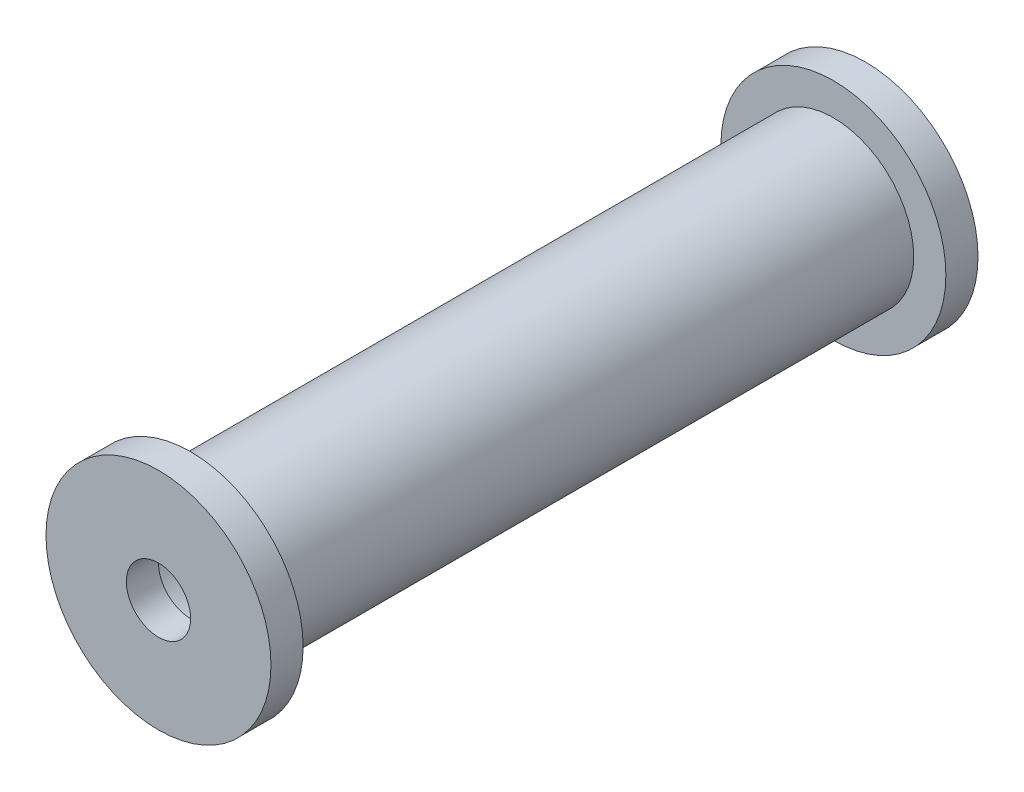
ISO-10303-21;
HEADER;
FILE_DESCRIPTION(('STEP AP214'),'2;1');
FILE_NAME('part.step','',(''),(''),'','','');
FILE_SCHEMA(('AUTOMOTIVE_DESIGN { 1 0 10303 214 1 1 1 1 }'));
ENDSEC;
DATA;
#1=APPLICATION_CONTEXT('core data for automotive mechanical design processes');
#2=APPLICATION_PROTOCOL_DEFINITION('international standard','automotive_design',2000,#1);
#3=PRODUCT_CONTEXT('',#1,'mechanical');
#4=PRODUCT('Part','Part','',(#3));
#5=PRODUCT_RELATED_PRODUCT_CATEGORY('part','',(#4));
#6=PRODUCT_DEFINITION_FORMATION('','',#4);
#7=PRODUCT_DEFINITION_CONTEXT('part definition',#1,'design');
#8=PRODUCT_DEFINITION('design','',#6,#7);
#9=PRODUCT_DEFINITION_SHAPE('','',#8);
#10=(LENGTH_UNIT() NAMED_UNIT(*) SI_UNIT(.MILLI.,.METRE.));
#11=(NAMED_UNIT(*) PLANE_ANGLE_UNIT() SI_UNIT($,.RADIAN.));
#12=(NAMED_UNIT(*) SI_UNIT($,.STERADIAN.) SOLID_ANGLE_UNIT());
#13=UNCERTAINTY_MEASURE_WITH_UNIT(LENGTH_MEASURE(1.E-05),#10,'distance_accuracy_value','');
#14=(GEOMETRIC_REPRESENTATION_CONTEXT(3) GLOBAL_UNCERTAINTY_ASSIGNED_CONTEXT((#13)) GLOBAL_UNIT_ASSIGNED_CONTEXT((#10,
#11,#12)) REPRESENTATION_CONTEXT('',''));
#15=CARTESIAN_POINT('',(0.,0.,0.));
#16=DIRECTION('',(0.,0.,1.));
#17=DIRECTION('',(1.,0.,0.));
#18=AXIS2_PLACEMENT_3D('',#15,#16,#17);
#19=CARTESIAN_POINT('',(0.,0.,200.));
#20=DIRECTION('',(0.,0.,-1.));
#21=DIRECTION('',(-1.,0.,0.));
#22=AXIS2_PLACEMENT_3D('',#19,#20,#21);
#23=CYLINDRICAL_SURFACE('',#22,25.);
#24=CARTESIAN_POINT('',(0.,0.,200.));
#25=DIRECTION('',(0.,0.,1.));
#26=DIRECTION('',(1.,0.,0.));
#27=AXIS2_PLACEMENT_3D('',#24,#25,#26);
#28=CIRCLE('',#27,25.);
#29=CARTESIAN_POINT('',(25.,0.,200.));
#30=VERTEX_POINT('',#29);
#31=EDGE_CURVE('E10',#30,#30,#28,.T.);
#32=ORIENTED_EDGE('',*,*,#31,.F.);
#33=EDGE_LOOP('',(#32));
#34=FACE_BOUND('',#33,.T.);
#35=CARTESIAN_POINT('',(0.,0.,0.));
#36=DIRECTION('',(0.,0.,1.));
#37=DIRECTION('',(1.,0.,0.));
#38=AXIS2_PLACEMENT_3D('',#35,#36,#37);
#39=CIRCLE('',#38,25.);
#40=CARTESIAN_POINT('',(25.,0.,0.));
#41=VERTEX_POINT('',#40);
#42=EDGE_CURVE('E36',#41,#41,#39,.T.);
#43=ORIENTED_EDGE('',*,*,#42,.T.);
#44=EDGE_LOOP('',(#43));
#45=FACE_BOUND('',#44,.T.);
#46=ADVANCED_FACE('F33',(#34,#45),#23,.T.);
#47=CARTESIAN_POINT('',(0.,0.,200.));
#48=DIRECTION('',(0.,0.,-1.));
#49=DIRECTION('',(-1.,0.,0.));
#50=AXIS2_PLACEMENT_3D('',#47,#48,#49);
#51=CYLINDRICAL_SURFACE('',#50,20.);
#52=CARTESIAN_POINT('',(0.,0.,200.));
#53=DIRECTION('',(0.,0.,1.));
#54=DIRECTION('',(1.,0.,0.));
#55=AXIS2_PLACEMENT_3D('',#52,#53,#54);
#56=CIRCLE('',#55,20.);
#57=CARTESIAN_POINT('',(20.,0.,200.));
#58=VERTEX_POINT('',#57);
#59=EDGE_CURVE('E44',#58,#58,#56,.T.);
#60=ORIENTED_EDGE('',*,*,#59,.T.);
#61=EDGE_LOOP('',(#60));
#62=FACE_BOUND('',#61,.T.);
#63=CARTESIAN_POINT('',(0.,0.,0.));
#64=DIRECTION('',(0.,0.,1.));
#65=DIRECTION('',(1.,0.,0.));
#66=AXIS2_PLACEMENT_3D('',#63,#64,#65);
#67=CIRCLE('',#66,20.);
#68=CARTESIAN_POINT('',(20.,0.,0.));
#69=VERTEX_POINT('',#68);
#70=EDGE_CURVE('E40',#69,#69,#67,.T.);
#71=ORIENTED_EDGE('',*,*,#70,.F.);
#72=EDGE_LOOP('',(#71));
#73=FACE_BOUND('',#72,.T.);
#74=ADVANCED_FACE('F94',(#62,#73),#51,.F.);
#75=CARTESIAN_POINT('',(0.,0.,200.));
#76=DIRECTION('',(0.,0.,1.));
#77=DIRECTION('',(1.,0.,0.));
#78=AXIS2_PLACEMENT_3D('',#75,#76,#77);
#79=PLANE('',#78);
#80=CARTESIAN_POINT('',(0.,0.,200.));
#81=DIRECTION('',(0.,0.,1.));
#82=DIRECTION('',(1.,0.,0.));
#83=AXIS2_PLACEMENT_3D('',#80,#81,#82);
#84=CIRCLE('',#83,10.);
#85=CARTESIAN_POINT('',(10.,0.,200.));
#86=VERTEX_POINT('',#85);
#87=EDGE_CURVE('E56',#86,#86,#84,.T.);
#88=ORIENTED_EDGE('',*,*,#87,.T.);
#89=EDGE_LOOP('',(#88));
#90=FACE_BOUND('',#89,.T.);
#91=ORIENTED_EDGE('',*,*,#59,.F.);
#92=EDGE_LOOP('',(#91));
#93=FACE_BOUND('',#92,.T.);
#94=ADVANCED_FACE('F99',(#90,#93),#79,.F.);
#95=CARTESIAN_POINT('',(0.,0.,210.));
#96=DIRECTION('',(0.,0.,1.));
#97=DIRECTION('',(1.,0.,0.));
#98=AXIS2_PLACEMENT_3D('',#95,#96,#97);
#99=PLANE('',#98);
#100=CARTESIAN_POINT('',(0.,0.,210.));
#101=DIRECTION('',(0.,0.,1.));
#102=DIRECTION('',(1.,0.,0.));
#103=AXIS2_PLACEMENT_3D('',#100,#101,#102);
#104=CIRCLE('',#103,35.);
#105=CARTESIAN_POINT('',(35.,0.,210.));
#106=VERTEX_POINT('',#105);
#107=EDGE_CURVE('E49',#106,#106,#104,.T.);
#108=ORIENTED_EDGE('',*,*,#107,.T.);
#109=EDGE_LOOP('',(#108));
#110=FACE_BOUND('',#109,.T.);
#111=CARTESIAN_POINT('',(0.,0.,210.));
#112=DIRECTION('',(0.,0.,1.));
#113=DIRECTION('',(1.,0.,0.));
#114=AXIS2_PLACEMENT_3D('',#111,#112,#113);
#115=CIRCLE('',#114,10.);
#116=CARTESIAN_POINT('',(10.,0.,210.));
#117=VERTEX_POINT('',#116);
#118=EDGE_CURVE('E53',#117,#117,#115,.T.);
#119=ORIENTED_EDGE('',*,*,#118,.F.);
#120=EDGE_LOOP('',(#119));
#121=FACE_BOUND('',#120,.T.);
#122=ADVANCED_FACE('F119',(#110,#121),#99,.T.);
#123=ORIENTED_EDGE('',*,*,#31,.T.);
#124=EDGE_LOOP('',(#123));
#125=FACE_BOUND('',#124,.T.);
#126=CARTESIAN_POINT('',(0.,0.,200.));
#127=DIRECTION('',(0.,0.,1.));
#128=DIRECTION('',(1.,0.,0.));
#129=AXIS2_PLACEMENT_3D('',#126,#127,#128);
#130=CIRCLE('',#129,35.);
#131=CARTESIAN_POINT('',(35.,0.,200.));
#132=VERTEX_POINT('',#131);
#133=EDGE_CURVE('E50',#132,#132,#130,.T.);
#134=ORIENTED_EDGE('',*,*,#133,.F.);
#135=EDGE_LOOP('',(#134));
#136=FACE_BOUND('',#135,.T.);
#137=ADVANCED_FACE('F122',(#125,#136),#79,.F.);
#138=CARTESIAN_POINT('',(0.,0.,210.));
#139=DIRECTION('',(0.,0.,-1.));
#140=DIRECTION('',(-1.,0.,0.));
#141=AXIS2_PLACEMENT_3D('',#138,#139,#140);
#142=CYLINDRICAL_SURFACE('',#141,35.);
#143=ORIENTED_EDGE('',*,*,#107,.F.);
#144=EDGE_LOOP('',(#143));
#145=FACE_BOUND('',#144,.T.);
#146=ORIENTED_EDGE('',*,*,#133,.T.);
#147=EDGE_LOOP('',(#146));
#148=FACE_BOUND('',#147,.T.);
#149=ADVANCED_FACE('F117',(#145,#148),#142,.T.);
#150=CARTESIAN_POINT('',(0.,0.,210.));
#151=DIRECTION('',(0.,0.,-1.));
#152=DIRECTION('',(-1.,0.,0.));
#153=AXIS2_PLACEMENT_3D('',#150,#151,#152);
#154=CYLINDRICAL_SURFACE('',#153,10.);
#155=ORIENTED_EDGE('',*,*,#118,.T.);
#156=EDGE_LOOP('',(#155));
#157=FACE_BOUND('',#156,.T.);
#158=ORIENTED_EDGE('',*,*,#87,.F.);
#159=EDGE_LOOP('',(#158));
#160=FACE_BOUND('',#159,.T.);
#161=ADVANCED_FACE('F90',(#157,#160),#154,.F.);
#162=CARTESIAN_POINT('',(0.,0.,0.));
#163=DIRECTION('',(0.,0.,-1.));
#164=DIRECTION('',(-1.,0.,0.));
#165=AXIS2_PLACEMENT_3D('',#162,#163,#164);
#166=PLANE('',#165);
#167=CARTESIAN_POINT('',(0.,0.,0.));
#168=DIRECTION('',(0.,0.,-1.));
#169=DIRECTION('',(-1.,0.,0.));
#170=AXIS2_PLACEMENT_3D('',#167,#168,#169);
#171=CIRCLE('',#170,10.);
#172=CARTESIAN_POINT('',(-10.,0.,0.));
#173=VERTEX_POINT('',#172);
#174=EDGE_CURVE('E68',#173,#173,#171,.T.);
#175=ORIENTED_EDGE('',*,*,#174,.T.);
#176=EDGE_LOOP('',(#175));
#177=FACE_BOUND('',#176,.T.);
#178=ORIENTED_EDGE('',*,*,#70,.T.);
#179=EDGE_LOOP('',(#178));
#180=FACE_BOUND('',#179,.T.);
#181=ADVANCED_FACE('F80',(#177,#180),#166,.F.);
#182=CARTESIAN_POINT('',(0.,0.,-10.));
#183=DIRECTION('',(0.,0.,-1.));
#184=DIRECTION('',(-1.,0.,0.));
#185=AXIS2_PLACEMENT_3D('',#182,#183,#184);
#186=PLANE('',#185);
#187=CARTESIAN_POINT('',(0.,0.,-10.));
#188=DIRECTION('',(0.,0.,-1.));
#189=DIRECTION('',(-1.,0.,0.));
#190=AXIS2_PLACEMENT_3D('',#187,#188,#189);
#191=CIRCLE('',#190,35.);
#192=CARTESIAN_POINT('',(-35.,0.,-10.));
#193=VERTEX_POINT('',#192);
#194=EDGE_CURVE('E64',#193,#193,#191,.T.);
#195=ORIENTED_EDGE('',*,*,#194,.T.);
#196=EDGE_LOOP('',(#195));
#197=FACE_BOUND('',#196,.T.);
#198=CARTESIAN_POINT('',(0.,0.,-10.));
#199=DIRECTION('',(0.,0.,-1.));
#200=DIRECTION('',(-1.,0.,0.));
#201=AXIS2_PLACEMENT_3D('',#198,#199,#200);
#202=CIRCLE('',#201,10.);
#203=CARTESIAN_POINT('',(-10.,0.,-10.));
#204=VERTEX_POINT('',#203);
#205=EDGE_CURVE('E65',#204,#204,#202,.T.);
#206=ORIENTED_EDGE('',*,*,#205,.F.);
#207=EDGE_LOOP('',(#206));
#208=FACE_BOUND('',#207,.T.);
#209=ADVANCED_FACE('F77',(#197,#208),#186,.T.);
#210=ORIENTED_EDGE('',*,*,#42,.F.);
#211=EDGE_LOOP('',(#210));
#212=FACE_BOUND('',#211,.T.);
#213=CARTESIAN_POINT('',(0.,0.,0.));
#214=DIRECTION('',(0.,0.,-1.));
#215=DIRECTION('',(-1.,0.,0.));
#216=AXIS2_PLACEMENT_3D('',#213,#214,#215);
#217=CIRCLE('',#216,35.);
#218=CARTESIAN_POINT('',(-35.,0.,0.));
#219=VERTEX_POINT('',#218);
#220=EDGE_CURVE('E61',#219,#219,#217,.T.);
#221=ORIENTED_EDGE('',*,*,#220,.F.);
#222=EDGE_LOOP('',(#221));
#223=FACE_BOUND('',#222,.T.);
#224=ADVANCED_FACE('F79',(#212,#223),#166,.F.);
#225=CARTESIAN_POINT('',(0.,0.,-10.));
#226=DIRECTION('',(0.,0.,1.));
#227=DIRECTION('',(1.,0.,0.));
#228=AXIS2_PLACEMENT_3D('',#225,#226,#227);
#229=CYLINDRICAL_SURFACE('',#228,35.);
#230=ORIENTED_EDGE('',*,*,#194,.F.);
#231=EDGE_LOOP('',(#230));
#232=FACE_BOUND('',#231,.T.);
#233=ORIENTED_EDGE('',*,*,#220,.T.);
#234=EDGE_LOOP('',(#233));
#235=FACE_BOUND('',#234,.T.);
#236=ADVANCED_FACE('F87',(#232,#235),#229,.T.);
#237=CARTESIAN_POINT('',(0.,0.,-10.));
#238=DIRECTION('',(0.,0.,1.));
#239=DIRECTION('',(1.,0.,0.));
#240=AXIS2_PLACEMENT_3D('',#237,#238,#239);
#241=CYLINDRICAL_SURFACE('',#240,10.);
#242=ORIENTED_EDGE('',*,*,#205,.T.);
#243=EDGE_LOOP('',(#242));
#244=FACE_BOUND('',#243,.T.);
#245=ORIENTED_EDGE('',*,*,#174,.F.);
#246=EDGE_LOOP('',(#245));
#247=FACE_BOUND('',#246,.T.);
#248=ADVANCED_FACE('F74',(#244,#247),#241,.F.);
#249=CLOSED_SHELL('',(#46,#74,#94,#122,#137,#149,#161,#181,#209,#224,#236,#248));
#250=MANIFOLD_SOLID_BREP('B2',#249);
#251=ADVANCED_BREP_SHAPE_REPRESENTATION('',(#18,#250),#14);
#252=SHAPE_DEFINITION_REPRESENTATION(#9,#251);
ENDSEC;
END-ISO-10303-21;
